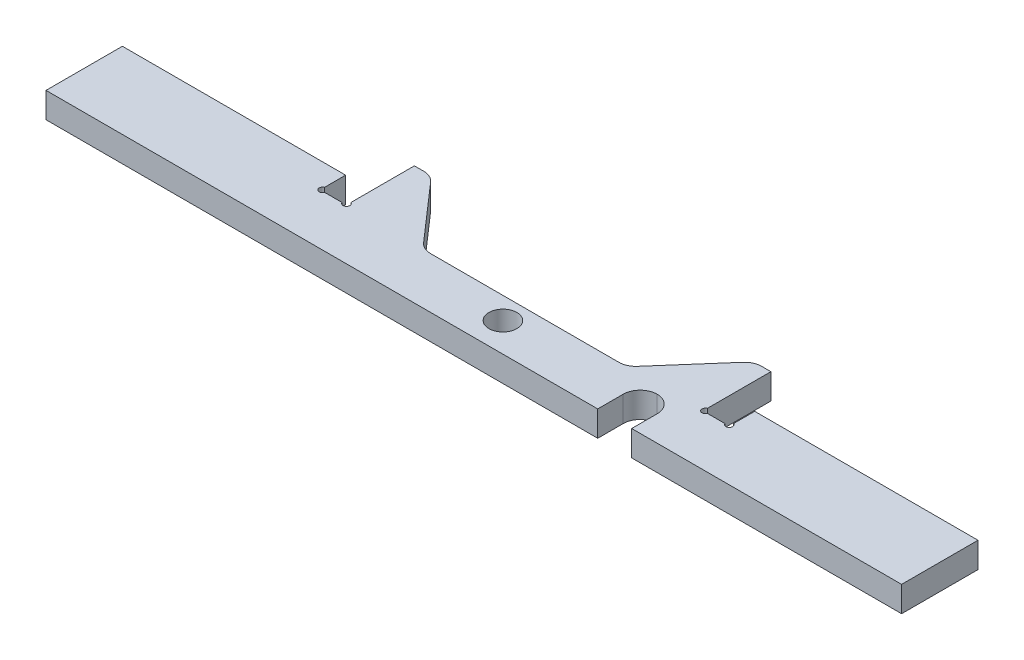
ISO-10303-21;
HEADER;
FILE_DESCRIPTION(('STEP AP214'),'2;1');
FILE_NAME('part.step','',(''),(''),'','','');
FILE_SCHEMA(('AUTOMOTIVE_DESIGN { 1 0 10303 214 1 1 1 1 }'));
ENDSEC;
DATA;
#1=APPLICATION_CONTEXT('core data for automotive mechanical design processes');
#2=APPLICATION_PROTOCOL_DEFINITION('international standard','automotive_design',2000,#1);
#3=PRODUCT_CONTEXT('',#1,'mechanical');
#4=PRODUCT('Part','Part','',(#3));
#5=PRODUCT_RELATED_PRODUCT_CATEGORY('part','',(#4));
#6=PRODUCT_DEFINITION_FORMATION('','',#4);
#7=PRODUCT_DEFINITION_CONTEXT('part definition',#1,'design');
#8=PRODUCT_DEFINITION('design','',#6,#7);
#9=PRODUCT_DEFINITION_SHAPE('','',#8);
#10=(LENGTH_UNIT() NAMED_UNIT(*) SI_UNIT(.MILLI.,.METRE.));
#11=(NAMED_UNIT(*) PLANE_ANGLE_UNIT() SI_UNIT($,.RADIAN.));
#12=(NAMED_UNIT(*) SI_UNIT($,.STERADIAN.) SOLID_ANGLE_UNIT());
#13=UNCERTAINTY_MEASURE_WITH_UNIT(LENGTH_MEASURE(1.E-05),#10,'distance_accuracy_value','');
#14=(GEOMETRIC_REPRESENTATION_CONTEXT(3) GLOBAL_UNCERTAINTY_ASSIGNED_CONTEXT((#13)) GLOBAL_UNIT_ASSIGNED_CONTEXT((#10,
#11,#12)) REPRESENTATION_CONTEXT('',''));
#15=CARTESIAN_POINT('',(0.,0.,0.));
#16=DIRECTION('',(0.,0.,1.));
#17=DIRECTION('',(1.,0.,0.));
#18=AXIS2_PLACEMENT_3D('',#15,#16,#17);
#19=CARTESIAN_POINT('',(-105.,15.,0.));
#20=DIRECTION('',(0.,0.,-1.));
#21=DIRECTION('',(-1.,0.,0.));
#22=AXIS2_PLACEMENT_3D('',#19,#20,#21);
#23=PLANE('',#22);
#24=DIRECTION('',(1.,0.,0.));
#25=VECTOR('',#24,1.);
#26=CARTESIAN_POINT('',(-105.,15.,0.));
#27=LINE('',#26,#25);
#28=CARTESIAN_POINT('',(93.,15.,0.));
#29=VERTEX_POINT('',#28);
#30=CARTESIAN_POINT('',(252.,15.,0.));
#31=VERTEX_POINT('',#30);
#32=EDGE_CURVE('E353',#29,#31,#27,.T.);
#33=ORIENTED_EDGE('',*,*,#32,.F.);
#34=DIRECTION('',(0.,1.,0.));
#35=VECTOR('',#34,1.);
#36=CARTESIAN_POINT('',(93.,0.,0.));
#37=LINE('',#36,#35);
#38=CARTESIAN_POINT('',(93.,0.,0.));
#39=VERTEX_POINT('',#38);
#40=EDGE_CURVE('E294',#39,#29,#37,.T.);
#41=ORIENTED_EDGE('',*,*,#40,.F.);
#42=DIRECTION('',(1.,0.,0.));
#43=VECTOR('',#42,1.);
#44=CARTESIAN_POINT('',(-105.,0.,0.));
#45=LINE('',#44,#43);
#46=CARTESIAN_POINT('',(252.,0.,0.));
#47=VERTEX_POINT('',#46);
#48=EDGE_CURVE('E385',#39,#47,#45,.T.);
#49=ORIENTED_EDGE('',*,*,#48,.T.);
#50=DIRECTION('',(0.,1.,0.));
#51=VECTOR('',#50,1.);
#52=CARTESIAN_POINT('',(252.,-153.733535703827,0.));
#53=LINE('',#52,#51);
#54=EDGE_CURVE('E305',#47,#31,#53,.T.);
#55=ORIENTED_EDGE('',*,*,#54,.T.);
#56=EDGE_LOOP('',(#33,#41,#49,#55));
#57=FACE_BOUND('',#56,.T.);
#58=ADVANCED_FACE('F45',(#57),#23,.F.);
#59=CARTESIAN_POINT('',(105.,15.,0.));
#60=DIRECTION('',(-1.,0.,0.));
#61=DIRECTION('',(0.,0.,1.));
#62=AXIS2_PLACEMENT_3D('',#59,#60,#61);
#63=PLANE('',#62);
#64=DIRECTION('',(0.,0.,-1.));
#65=VECTOR('',#64,1.);
#66=CARTESIAN_POINT('',(105.,15.,0.));
#67=LINE('',#66,#65);
#68=CARTESIAN_POINT('',(105.,15.,-32.5779354745735));
#69=VERTEX_POINT('',#68);
#70=CARTESIAN_POINT('',(105.,15.,-70.));
#71=VERTEX_POINT('',#70);
#72=EDGE_CURVE('E359',#69,#71,#67,.T.);
#73=ORIENTED_EDGE('',*,*,#72,.F.);
#74=DIRECTION('',(0.,1.,0.));
#75=VECTOR('',#74,1.);
#76=CARTESIAN_POINT('',(105.,0.,-32.5779354745735));
#77=LINE('',#76,#75);
#78=CARTESIAN_POINT('',(105.,0.,-32.5779354745735));
#79=VERTEX_POINT('',#78);
#80=EDGE_CURVE('E492',#69,#79,#77,.F.);
#81=ORIENTED_EDGE('',*,*,#80,.T.);
#82=DIRECTION('',(0.,0.,-1.));
#83=VECTOR('',#82,1.);
#84=CARTESIAN_POINT('',(105.,0.,0.));
#85=LINE('',#84,#83);
#86=CARTESIAN_POINT('',(105.,0.,-70.));
#87=VERTEX_POINT('',#86);
#88=EDGE_CURVE('E390',#79,#87,#85,.T.);
#89=ORIENTED_EDGE('',*,*,#88,.T.);
#90=DIRECTION('',(0.,-1.,0.));
#91=VECTOR('',#90,1.);
#92=CARTESIAN_POINT('',(105.,15.,-70.));
#93=LINE('',#92,#91);
#94=EDGE_CURVE('E414',#71,#87,#93,.T.);
#95=ORIENTED_EDGE('',*,*,#94,.F.);
#96=EDGE_LOOP('',(#73,#81,#89,#95));
#97=FACE_BOUND('',#96,.T.);
#98=ADVANCED_FACE('F620',(#97),#63,.F.);
#99=CARTESIAN_POINT('',(0.,15.,0.));
#100=DIRECTION('',(0.,-1.,0.));
#101=DIRECTION('',(0.,0.,-1.));
#102=AXIS2_PLACEMENT_3D('',#99,#100,#101);
#103=PLANE('',#102);
#104=DIRECTION('',(1.,0.,0.));
#105=VECTOR('',#104,1.);
#106=CARTESIAN_POINT('',(-120.5,15.,-30.));
#107=LINE('',#106,#105);
#108=CARTESIAN_POINT('',(-117.922064525426,15.,-30.));
#109=VERTEX_POINT('',#108);
#110=CARTESIAN_POINT('',(-107.577935474573,15.,-30.));
#111=VERTEX_POINT('',#110);
#112=EDGE_CURVE('E256',#109,#111,#107,.T.);
#113=ORIENTED_EDGE('',*,*,#112,.F.);
#114=CARTESIAN_POINT('',(-119.792893218813,15.,-30.7071067811865));
#115=DIRECTION('',(0.,1.,0.));
#116=DIRECTION('',(0.,0.,1.));
#117=AXIS2_PLACEMENT_3D('',#114,#115,#116);
#118=CIRCLE('',#117,2.);
#119=CARTESIAN_POINT('',(-120.5,15.,-32.5779354745735));
#120=VERTEX_POINT('',#119);
#121=EDGE_CURVE('E260',#120,#109,#118,.T.);
#122=ORIENTED_EDGE('',*,*,#121,.F.);
#123=DIRECTION('',(0.,0.,1.));
#124=VECTOR('',#123,1.);
#125=CARTESIAN_POINT('',(-120.5,15.,-45.));
#126=LINE('',#125,#124);
#127=CARTESIAN_POINT('',(-120.5,15.,-45.));
#128=VERTEX_POINT('',#127);
#129=EDGE_CURVE('E266',#128,#120,#126,.T.);
#130=ORIENTED_EDGE('',*,*,#129,.F.);
#131=DIRECTION('',(1.,0.,0.));
#132=VECTOR('',#131,1.);
#133=CARTESIAN_POINT('',(-252.,15.,-45.));
#134=LINE('',#133,#132);
#135=CARTESIAN_POINT('',(-252.,15.,-45.));
#136=VERTEX_POINT('',#135);
#137=EDGE_CURVE('E298',#136,#128,#134,.T.);
#138=ORIENTED_EDGE('',*,*,#137,.F.);
#139=DIRECTION('',(0.,0.,-1.));
#140=VECTOR('',#139,1.);
#141=CARTESIAN_POINT('',(-252.,15.,0.));
#142=LINE('',#141,#140);
#143=CARTESIAN_POINT('',(-252.,15.,0.));
#144=VERTEX_POINT('',#143);
#145=EDGE_CURVE('E293',#144,#136,#142,.T.);
#146=ORIENTED_EDGE('',*,*,#145,.F.);
#147=CARTESIAN_POINT('',(73.,15.,0.));
#148=VERTEX_POINT('',#147);
#149=EDGE_CURVE('E355',#144,#148,#27,.T.);
#150=ORIENTED_EDGE('',*,*,#149,.T.);
#151=DIRECTION('',(0.,0.,1.));
#152=VECTOR('',#151,1.);
#153=CARTESIAN_POINT('',(73.,15.,0.));
#154=LINE('',#153,#152);
#155=CARTESIAN_POINT('',(73.,15.,-15.));
#156=VERTEX_POINT('',#155);
#157=EDGE_CURVE('E543',#156,#148,#154,.T.);
#158=ORIENTED_EDGE('',*,*,#157,.F.);
#159=CARTESIAN_POINT('',(83.,15.,-15.));
#160=DIRECTION('',(0.,-1.,0.));
#161=DIRECTION('',(0.,0.,-1.));
#162=AXIS2_PLACEMENT_3D('',#159,#160,#161);
#163=CIRCLE('',#162,10.);
#164=CARTESIAN_POINT('',(83.,15.,-25.));
#165=VERTEX_POINT('',#164);
#166=EDGE_CURVE('E477',#156,#165,#163,.T.);
#167=ORIENTED_EDGE('',*,*,#166,.T.);
#168=CARTESIAN_POINT('',(83.,15.,-15.));
#169=DIRECTION('',(0.,-1.,0.));
#170=DIRECTION('',(0.,0.,-1.));
#171=AXIS2_PLACEMENT_3D('',#168,#169,#170);
#172=CIRCLE('',#171,10.);
#173=CARTESIAN_POINT('',(93.,15.,-15.));
#174=VERTEX_POINT('',#173);
#175=EDGE_CURVE('E483',#165,#174,#172,.T.);
#176=ORIENTED_EDGE('',*,*,#175,.T.);
#177=DIRECTION('',(0.,0.,-1.));
#178=VECTOR('',#177,1.);
#179=CARTESIAN_POINT('',(93.,15.,0.));
#180=LINE('',#179,#178);
#181=EDGE_CURVE('E491',#29,#174,#180,.T.);
#182=ORIENTED_EDGE('',*,*,#181,.F.);
#183=ORIENTED_EDGE('',*,*,#32,.T.);
#184=DIRECTION('',(0.,0.,-1.));
#185=VECTOR('',#184,1.);
#186=CARTESIAN_POINT('',(252.,15.,0.));
#187=LINE('',#186,#185);
#188=CARTESIAN_POINT('',(252.,15.,-45.));
#189=VERTEX_POINT('',#188);
#190=EDGE_CURVE('E281',#31,#189,#187,.T.);
#191=ORIENTED_EDGE('',*,*,#190,.T.);
#192=DIRECTION('',(-1.,0.,0.));
#193=VECTOR('',#192,1.);
#194=CARTESIAN_POINT('',(252.,15.,-45.));
#195=LINE('',#194,#193);
#196=CARTESIAN_POINT('',(120.5,15.,-45.));
#197=VERTEX_POINT('',#196);
#198=EDGE_CURVE('E310',#189,#197,#195,.T.);
#199=ORIENTED_EDGE('',*,*,#198,.T.);
#200=DIRECTION('',(0.,0.,1.));
#201=VECTOR('',#200,1.);
#202=CARTESIAN_POINT('',(120.5,15.,-45.));
#203=LINE('',#202,#201);
#204=CARTESIAN_POINT('',(120.5,15.,-32.5779354745735));
#205=VERTEX_POINT('',#204);
#206=EDGE_CURVE('E306',#197,#205,#203,.T.);
#207=ORIENTED_EDGE('',*,*,#206,.T.);
#208=CARTESIAN_POINT('',(119.792893218813,15.,-30.7071067811865));
#209=DIRECTION('',(0.,1.,0.));
#210=DIRECTION('',(0.,0.,-1.));
#211=AXIS2_PLACEMENT_3D('',#208,#209,#210);
#212=CIRCLE('',#211,2.);
#213=CARTESIAN_POINT('',(117.922064525426,15.,-30.));
#214=VERTEX_POINT('',#213);
#215=EDGE_CURVE('E498',#214,#205,#212,.T.);
#216=ORIENTED_EDGE('',*,*,#215,.F.);
#217=DIRECTION('',(-1.,0.,0.));
#218=VECTOR('',#217,1.);
#219=CARTESIAN_POINT('',(120.5,15.,-30.));
#220=LINE('',#219,#218);
#221=CARTESIAN_POINT('',(107.577935474573,15.,-30.));
#222=VERTEX_POINT('',#221);
#223=EDGE_CURVE('E301',#214,#222,#220,.T.);
#224=ORIENTED_EDGE('',*,*,#223,.T.);
#225=CARTESIAN_POINT('',(105.707106781187,15.,-30.7071067811865));
#226=DIRECTION('',(0.,1.,0.));
#227=DIRECTION('',(0.,0.,1.));
#228=AXIS2_PLACEMENT_3D('',#225,#226,#227);
#229=CIRCLE('',#228,2.);
#230=EDGE_CURVE('E60',#69,#222,#229,.T.);
#231=ORIENTED_EDGE('',*,*,#230,.F.);
#232=ORIENTED_EDGE('',*,*,#72,.T.);
#233=DIRECTION('',(-1.,0.,0.));
#234=VECTOR('',#233,1.);
#235=CARTESIAN_POINT('',(105.,15.,-70.));
#236=LINE('',#235,#234);
#237=CARTESIAN_POINT('',(99.5376822659183,15.,-70.));
#238=VERTEX_POINT('',#237);
#239=EDGE_CURVE('E362',#71,#238,#236,.T.);
#240=ORIENTED_EDGE('',*,*,#239,.T.);
#241=CARTESIAN_POINT('',(99.5376822659183,15.,-60.));
#242=DIRECTION('',(0.,-1.,0.));
#243=DIRECTION('',(0.,0.,-1.));
#244=AXIS2_PLACEMENT_3D('',#241,#242,#243);
#245=CIRCLE('',#244,10.);
#246=CARTESIAN_POINT('',(92.0119153188495,15.,-66.5850460786852));
#247=VERTEX_POINT('',#246);
#248=EDGE_CURVE('E449',#238,#247,#245,.F.);
#249=ORIENTED_EDGE('',*,*,#248,.T.);
#250=DIRECTION('',(-0.658504607868518,0.,0.752576694706878));
#251=VECTOR('',#250,1.);
#252=CARTESIAN_POINT('',(60.,15.,-30.));
#253=LINE('',#252,#251);
#254=CARTESIAN_POINT('',(62.9880846811505,15.,-33.4149539213148));
#255=VERTEX_POINT('',#254);
#256=EDGE_CURVE('E366',#247,#255,#253,.T.);
#257=ORIENTED_EDGE('',*,*,#256,.T.);
#258=CARTESIAN_POINT('',(55.4623177340817,15.,-40.));
#259=DIRECTION('',(0.,-1.,0.));
#260=DIRECTION('',(0.,0.,-1.));
#261=AXIS2_PLACEMENT_3D('',#258,#259,#260);
#262=CIRCLE('',#261,10.);
#263=CARTESIAN_POINT('',(55.4623177340817,15.,-30.));
#264=VERTEX_POINT('',#263);
#265=EDGE_CURVE('E467',#255,#264,#262,.T.);
#266=ORIENTED_EDGE('',*,*,#265,.T.);
#267=DIRECTION('',(-1.,0.,0.));
#268=VECTOR('',#267,1.);
#269=CARTESIAN_POINT('',(60.,15.,-30.));
#270=LINE('',#269,#268);
#271=CARTESIAN_POINT('',(-55.4623177340817,15.,-30.));
#272=VERTEX_POINT('',#271);
#273=EDGE_CURVE('E370',#264,#272,#270,.T.);
#274=ORIENTED_EDGE('',*,*,#273,.T.);
#275=CARTESIAN_POINT('',(-55.4623177340817,15.,-40.));
#276=DIRECTION('',(0.,-1.,0.));
#277=DIRECTION('',(0.,0.,-1.));
#278=AXIS2_PLACEMENT_3D('',#275,#276,#277);
#279=CIRCLE('',#278,10.);
#280=CARTESIAN_POINT('',(-62.9880846811505,15.,-33.4149539213148));
#281=VERTEX_POINT('',#280);
#282=EDGE_CURVE('E461',#272,#281,#279,.T.);
#283=ORIENTED_EDGE('',*,*,#282,.T.);
#284=DIRECTION('',(-0.658504607868518,0.,-0.752576694706878));
#285=VECTOR('',#284,1.);
#286=CARTESIAN_POINT('',(-60.,15.,-30.));
#287=LINE('',#286,#285);
#288=CARTESIAN_POINT('',(-92.0119153188495,15.,-66.5850460786852));
#289=VERTEX_POINT('',#288);
#290=EDGE_CURVE('E374',#281,#289,#287,.T.);
#291=ORIENTED_EDGE('',*,*,#290,.T.);
#292=CARTESIAN_POINT('',(-99.5376822659183,15.,-60.));
#293=DIRECTION('',(0.,-1.,0.));
#294=DIRECTION('',(0.,0.,-1.));
#295=AXIS2_PLACEMENT_3D('',#292,#293,#294);
#296=CIRCLE('',#295,10.);
#297=CARTESIAN_POINT('',(-99.5376822659183,15.,-70.));
#298=VERTEX_POINT('',#297);
#299=EDGE_CURVE('E452',#289,#298,#296,.F.);
#300=ORIENTED_EDGE('',*,*,#299,.T.);
#301=DIRECTION('',(-1.,0.,0.));
#302=VECTOR('',#301,1.);
#303=CARTESIAN_POINT('',(-105.,15.,-70.));
#304=LINE('',#303,#302);
#305=CARTESIAN_POINT('',(-105.,15.,-70.));
#306=VERTEX_POINT('',#305);
#307=EDGE_CURVE('E378',#298,#306,#304,.T.);
#308=ORIENTED_EDGE('',*,*,#307,.T.);
#309=DIRECTION('',(0.,0.,1.));
#310=VECTOR('',#309,1.);
#311=CARTESIAN_POINT('',(-105.,15.,0.));
#312=LINE('',#311,#310);
#313=CARTESIAN_POINT('',(-105.,15.,-32.5779354745735));
#314=VERTEX_POINT('',#313);
#315=EDGE_CURVE('E258',#306,#314,#312,.T.);
#316=ORIENTED_EDGE('',*,*,#315,.T.);
#317=CARTESIAN_POINT('',(-105.707106781187,15.,-30.7071067811865));
#318=DIRECTION('',(0.,1.,0.));
#319=DIRECTION('',(0.,0.,-1.));
#320=AXIS2_PLACEMENT_3D('',#317,#318,#319);
#321=CIRCLE('',#320,2.);
#322=EDGE_CURVE('E238',#111,#314,#321,.T.);
#323=ORIENTED_EDGE('',*,*,#322,.F.);
#324=EDGE_LOOP('',(#113,#122,#130,#138,#146,#150,#158,#167,#176,#182,#183,#191,#199,#207,#216,
#224,#231,#232,#240,#249,#257,#266,#274,#283,#291,#300,#308,#316,#323));
#325=FACE_BOUND('',#324,.T.);
#326=CARTESIAN_POINT('',(0.,15.,-17.15));
#327=DIRECTION('',(0.,1.,0.));
#328=DIRECTION('',(0.,0.,1.));
#329=AXIS2_PLACEMENT_3D('',#326,#327,#328);
#330=CIRCLE('',#329,8.25);
#331=CARTESIAN_POINT('',(0.,15.,-8.9));
#332=VERTEX_POINT('',#331);
#333=EDGE_CURVE('E343',#332,#332,#330,.T.);
#334=ORIENTED_EDGE('',*,*,#333,.F.);
#335=EDGE_LOOP('',(#334));
#336=FACE_BOUND('',#335,.T.);
#337=ADVANCED_FACE('F253',(#325,#336),#103,.F.);
#338=CARTESIAN_POINT('',(0.,0.,0.));
#339=DIRECTION('',(0.,-1.,0.));
#340=DIRECTION('',(0.,0.,-1.));
#341=AXIS2_PLACEMENT_3D('',#338,#339,#340);
#342=PLANE('',#341);
#343=CARTESIAN_POINT('',(-119.792893218813,0.,-30.7071067811865));
#344=DIRECTION('',(0.,1.,0.));
#345=DIRECTION('',(0.,0.,1.));
#346=AXIS2_PLACEMENT_3D('',#343,#344,#345);
#347=CIRCLE('',#346,2.);
#348=CARTESIAN_POINT('',(-120.5,0.,-32.5779354745735));
#349=VERTEX_POINT('',#348);
#350=CARTESIAN_POINT('',(-117.922064525426,0.,-30.));
#351=VERTEX_POINT('',#350);
#352=EDGE_CURVE('E529',#349,#351,#347,.T.);
#353=ORIENTED_EDGE('',*,*,#352,.T.);
#354=DIRECTION('',(1.,0.,0.));
#355=VECTOR('',#354,1.);
#356=CARTESIAN_POINT('',(-120.5,0.,-30.));
#357=LINE('',#356,#355);
#358=CARTESIAN_POINT('',(-107.577935474573,0.,-30.));
#359=VERTEX_POINT('',#358);
#360=EDGE_CURVE('E265',#351,#359,#357,.T.);
#361=ORIENTED_EDGE('',*,*,#360,.T.);
#362=CARTESIAN_POINT('',(-105.707106781187,0.,-30.7071067811865));
#363=DIRECTION('',(0.,1.,0.));
#364=DIRECTION('',(0.,0.,-1.));
#365=AXIS2_PLACEMENT_3D('',#362,#363,#364);
#366=CIRCLE('',#365,2.);
#367=CARTESIAN_POINT('',(-105.,0.,-32.5779354745735));
#368=VERTEX_POINT('',#367);
#369=EDGE_CURVE('E241',#359,#368,#366,.T.);
#370=ORIENTED_EDGE('',*,*,#369,.T.);
#371=DIRECTION('',(0.,0.,1.));
#372=VECTOR('',#371,1.);
#373=CARTESIAN_POINT('',(-105.,0.,0.));
#374=LINE('',#373,#372);
#375=CARTESIAN_POINT('',(-105.,0.,-70.));
#376=VERTEX_POINT('',#375);
#377=EDGE_CURVE('E347',#376,#368,#374,.T.);
#378=ORIENTED_EDGE('',*,*,#377,.F.);
#379=DIRECTION('',(-1.,0.,0.));
#380=VECTOR('',#379,1.);
#381=CARTESIAN_POINT('',(-105.,0.,-70.));
#382=LINE('',#381,#380);
#383=CARTESIAN_POINT('',(-99.5376822659183,0.,-70.));
#384=VERTEX_POINT('',#383);
#385=EDGE_CURVE('E354',#384,#376,#382,.T.);
#386=ORIENTED_EDGE('',*,*,#385,.F.);
#387=CARTESIAN_POINT('',(-99.5376822659183,0.,-60.));
#388=DIRECTION('',(0.,-1.,0.));
#389=DIRECTION('',(0.,0.,-1.));
#390=AXIS2_PLACEMENT_3D('',#387,#388,#389);
#391=CIRCLE('',#390,10.);
#392=CARTESIAN_POINT('',(-92.0119153188495,0.,-66.5850460786852));
#393=VERTEX_POINT('',#392);
#394=EDGE_CURVE('E446',#384,#393,#391,.T.);
#395=ORIENTED_EDGE('',*,*,#394,.T.);
#396=DIRECTION('',(-0.658504607868518,0.,-0.752576694706878));
#397=VECTOR('',#396,1.);
#398=CARTESIAN_POINT('',(-60.,0.,-30.));
#399=LINE('',#398,#397);
#400=CARTESIAN_POINT('',(-62.9880846811505,0.,-33.4149539213148));
#401=VERTEX_POINT('',#400);
#402=EDGE_CURVE('E405',#401,#393,#399,.T.);
#403=ORIENTED_EDGE('',*,*,#402,.F.);
#404=CARTESIAN_POINT('',(-55.4623177340817,0.,-40.));
#405=DIRECTION('',(0.,-1.,0.));
#406=DIRECTION('',(0.,0.,-1.));
#407=AXIS2_PLACEMENT_3D('',#404,#405,#406);
#408=CIRCLE('',#407,10.);
#409=CARTESIAN_POINT('',(-55.4623177340817,0.,-30.));
#410=VERTEX_POINT('',#409);
#411=EDGE_CURVE('E458',#401,#410,#408,.F.);
#412=ORIENTED_EDGE('',*,*,#411,.T.);
#413=DIRECTION('',(-1.,0.,0.));
#414=VECTOR('',#413,1.);
#415=CARTESIAN_POINT('',(60.,0.,-30.));
#416=LINE('',#415,#414);
#417=CARTESIAN_POINT('',(55.4623177340817,0.,-30.));
#418=VERTEX_POINT('',#417);
#419=EDGE_CURVE('E401',#418,#410,#416,.T.);
#420=ORIENTED_EDGE('',*,*,#419,.F.);
#421=CARTESIAN_POINT('',(55.4623177340817,0.,-40.));
#422=DIRECTION('',(0.,-1.,0.));
#423=DIRECTION('',(0.,0.,-1.));
#424=AXIS2_PLACEMENT_3D('',#421,#422,#423);
#425=CIRCLE('',#424,10.);
#426=CARTESIAN_POINT('',(62.9880846811505,0.,-33.4149539213148));
#427=VERTEX_POINT('',#426);
#428=EDGE_CURVE('E464',#418,#427,#425,.F.);
#429=ORIENTED_EDGE('',*,*,#428,.T.);
#430=DIRECTION('',(-0.658504607868518,0.,0.752576694706878));
#431=VECTOR('',#430,1.);
#432=CARTESIAN_POINT('',(60.,0.,-30.));
#433=LINE('',#432,#431);
#434=CARTESIAN_POINT('',(92.0119153188495,0.,-66.5850460786852));
#435=VERTEX_POINT('',#434);
#436=EDGE_CURVE('E397',#435,#427,#433,.T.);
#437=ORIENTED_EDGE('',*,*,#436,.F.);
#438=CARTESIAN_POINT('',(99.5376822659183,0.,-60.));
#439=DIRECTION('',(0.,-1.,0.));
#440=DIRECTION('',(0.,0.,-1.));
#441=AXIS2_PLACEMENT_3D('',#438,#439,#440);
#442=CIRCLE('',#441,10.);
#443=CARTESIAN_POINT('',(99.5376822659183,0.,-70.));
#444=VERTEX_POINT('',#443);
#445=EDGE_CURVE('E443',#435,#444,#442,.T.);
#446=ORIENTED_EDGE('',*,*,#445,.T.);
#447=DIRECTION('',(-1.,0.,0.));
#448=VECTOR('',#447,1.);
#449=CARTESIAN_POINT('',(105.,0.,-70.));
#450=LINE('',#449,#448);
#451=EDGE_CURVE('E393',#87,#444,#450,.T.);
#452=ORIENTED_EDGE('',*,*,#451,.F.);
#453=ORIENTED_EDGE('',*,*,#88,.F.);
#454=CARTESIAN_POINT('',(105.707106781187,0.,-30.7071067811865));
#455=DIRECTION('',(0.,1.,0.));
#456=DIRECTION('',(0.,0.,1.));
#457=AXIS2_PLACEMENT_3D('',#454,#455,#456);
#458=CIRCLE('',#457,2.);
#459=CARTESIAN_POINT('',(107.577935474573,0.,-30.));
#460=VERTEX_POINT('',#459);
#461=EDGE_CURVE('E505',#79,#460,#458,.T.);
#462=ORIENTED_EDGE('',*,*,#461,.T.);
#463=DIRECTION('',(-1.,0.,0.));
#464=VECTOR('',#463,1.);
#465=CARTESIAN_POINT('',(120.5,0.,-30.));
#466=LINE('',#465,#464);
#467=CARTESIAN_POINT('',(117.922064525426,0.,-30.));
#468=VERTEX_POINT('',#467);
#469=EDGE_CURVE('E317',#468,#460,#466,.T.);
#470=ORIENTED_EDGE('',*,*,#469,.F.);
#471=CARTESIAN_POINT('',(119.792893218813,0.,-30.7071067811865));
#472=DIRECTION('',(0.,1.,0.));
#473=DIRECTION('',(0.,0.,-1.));
#474=AXIS2_PLACEMENT_3D('',#471,#472,#473);
#475=CIRCLE('',#474,2.);
#476=CARTESIAN_POINT('',(120.5,0.,-32.5779354745735));
#477=VERTEX_POINT('',#476);
#478=EDGE_CURVE('E68',#468,#477,#475,.T.);
#479=ORIENTED_EDGE('',*,*,#478,.T.);
#480=DIRECTION('',(0.,0.,1.));
#481=VECTOR('',#480,1.);
#482=CARTESIAN_POINT('',(120.5,0.,-45.));
#483=LINE('',#482,#481);
#484=CARTESIAN_POINT('',(120.5,0.,-45.));
#485=VERTEX_POINT('',#484);
#486=EDGE_CURVE('E322',#485,#477,#483,.T.);
#487=ORIENTED_EDGE('',*,*,#486,.F.);
#488=DIRECTION('',(-1.,0.,0.));
#489=VECTOR('',#488,1.);
#490=CARTESIAN_POINT('',(252.,0.,-45.));
#491=LINE('',#490,#489);
#492=CARTESIAN_POINT('',(252.,0.,-45.));
#493=VERTEX_POINT('',#492);
#494=EDGE_CURVE('E327',#493,#485,#491,.T.);
#495=ORIENTED_EDGE('',*,*,#494,.F.);
#496=DIRECTION('',(0.,0.,-1.));
#497=VECTOR('',#496,1.);
#498=CARTESIAN_POINT('',(252.,0.,0.));
#499=LINE('',#498,#497);
#500=EDGE_CURVE('E332',#47,#493,#499,.T.);
#501=ORIENTED_EDGE('',*,*,#500,.F.);
#502=ORIENTED_EDGE('',*,*,#48,.F.);
#503=DIRECTION('',(0.,0.,-1.));
#504=VECTOR('',#503,1.);
#505=CARTESIAN_POINT('',(93.,0.,0.));
#506=LINE('',#505,#504);
#507=CARTESIAN_POINT('',(93.,0.,-15.));
#508=VERTEX_POINT('',#507);
#509=EDGE_CURVE('E538',#39,#508,#506,.T.);
#510=ORIENTED_EDGE('',*,*,#509,.T.);
#511=CARTESIAN_POINT('',(83.,0.,-15.));
#512=DIRECTION('',(0.,-1.,0.));
#513=DIRECTION('',(0.,0.,-1.));
#514=AXIS2_PLACEMENT_3D('',#511,#512,#513);
#515=CIRCLE('',#514,10.);
#516=CARTESIAN_POINT('',(83.,0.,-25.));
#517=VERTEX_POINT('',#516);
#518=EDGE_CURVE('E248',#508,#517,#515,.F.);
#519=ORIENTED_EDGE('',*,*,#518,.T.);
#520=CARTESIAN_POINT('',(83.,0.,-15.));
#521=DIRECTION('',(0.,-1.,0.));
#522=DIRECTION('',(0.,0.,-1.));
#523=AXIS2_PLACEMENT_3D('',#520,#521,#522);
#524=CIRCLE('',#523,10.);
#525=CARTESIAN_POINT('',(73.,0.,-15.));
#526=VERTEX_POINT('',#525);
#527=EDGE_CURVE('E480',#517,#526,#524,.F.);
#528=ORIENTED_EDGE('',*,*,#527,.T.);
#529=DIRECTION('',(0.,0.,1.));
#530=VECTOR('',#529,1.);
#531=CARTESIAN_POINT('',(73.,0.,0.));
#532=LINE('',#531,#530);
#533=CARTESIAN_POINT('',(73.,0.,0.));
#534=VERTEX_POINT('',#533);
#535=EDGE_CURVE('E542',#526,#534,#532,.T.);
#536=ORIENTED_EDGE('',*,*,#535,.T.);
#537=CARTESIAN_POINT('',(-252.,0.,0.));
#538=VERTEX_POINT('',#537);
#539=EDGE_CURVE('E386',#538,#534,#45,.T.);
#540=ORIENTED_EDGE('',*,*,#539,.F.);
#541=DIRECTION('',(0.,0.,-1.));
#542=VECTOR('',#541,1.);
#543=CARTESIAN_POINT('',(-252.,0.,0.));
#544=LINE('',#543,#542);
#545=CARTESIAN_POINT('',(-252.,0.,-45.));
#546=VERTEX_POINT('',#545);
#547=EDGE_CURVE('E270',#538,#546,#544,.T.);
#548=ORIENTED_EDGE('',*,*,#547,.T.);
#549=DIRECTION('',(1.,0.,0.));
#550=VECTOR('',#549,1.);
#551=CARTESIAN_POINT('',(-252.,0.,-45.));
#552=LINE('',#551,#550);
#553=CARTESIAN_POINT('',(-120.5,0.,-45.));
#554=VERTEX_POINT('',#553);
#555=EDGE_CURVE('E282',#546,#554,#552,.T.);
#556=ORIENTED_EDGE('',*,*,#555,.T.);
#557=DIRECTION('',(0.,0.,1.));
#558=VECTOR('',#557,1.);
#559=CARTESIAN_POINT('',(-120.5,0.,-45.));
#560=LINE('',#559,#558);
#561=EDGE_CURVE('E277',#554,#349,#560,.T.);
#562=ORIENTED_EDGE('',*,*,#561,.T.);
#563=EDGE_LOOP('',(#353,#361,#370,#378,#386,#395,#403,#412,#420,#429,#437,#446,#452,#453,#462,
#470,#479,#487,#495,#501,#502,#510,#519,#528,#536,#540,#548,#556,#562));
#564=FACE_BOUND('',#563,.T.);
#565=CARTESIAN_POINT('',(0.,0.,-17.15));
#566=DIRECTION('',(0.,1.,0.));
#567=DIRECTION('',(0.,0.,1.));
#568=AXIS2_PLACEMENT_3D('',#565,#566,#567);
#569=CIRCLE('',#568,8.25);
#570=CARTESIAN_POINT('',(0.,0.,-8.9));
#571=VERTEX_POINT('',#570);
#572=EDGE_CURVE('E321',#571,#571,#569,.T.);
#573=ORIENTED_EDGE('',*,*,#572,.T.);
#574=EDGE_LOOP('',(#573));
#575=FACE_BOUND('',#574,.T.);
#576=ADVANCED_FACE('F514',(#564,#575),#342,.T.);
#577=CARTESIAN_POINT('',(-105.,15.,0.));
#578=DIRECTION('',(1.,0.,0.));
#579=DIRECTION('',(0.,0.,-1.));
#580=AXIS2_PLACEMENT_3D('',#577,#578,#579);
#581=PLANE('',#580);
#582=ORIENTED_EDGE('',*,*,#377,.T.);
#583=DIRECTION('',(0.,1.,0.));
#584=VECTOR('',#583,1.);
#585=CARTESIAN_POINT('',(-105.,0.,-32.5779354745735));
#586=LINE('',#585,#584);
#587=EDGE_CURVE('E525',#368,#314,#586,.T.);
#588=ORIENTED_EDGE('',*,*,#587,.T.);
#589=ORIENTED_EDGE('',*,*,#315,.F.);
#590=DIRECTION('',(0.,-1.,0.));
#591=VECTOR('',#590,1.);
#592=CARTESIAN_POINT('',(-105.,15.,-70.));
#593=LINE('',#592,#591);
#594=EDGE_CURVE('E381',#306,#376,#593,.T.);
#595=ORIENTED_EDGE('',*,*,#594,.T.);
#596=EDGE_LOOP('',(#582,#588,#589,#595));
#597=FACE_BOUND('',#596,.T.);
#598=ADVANCED_FACE('F630',(#597),#581,.F.);
#599=ORIENTED_EDGE('',*,*,#539,.T.);
#600=DIRECTION('',(0.,1.,0.));
#601=VECTOR('',#600,1.);
#602=CARTESIAN_POINT('',(73.,0.,0.));
#603=LINE('',#602,#601);
#604=EDGE_CURVE('E546',#534,#148,#603,.T.);
#605=ORIENTED_EDGE('',*,*,#604,.T.);
#606=ORIENTED_EDGE('',*,*,#149,.F.);
#607=DIRECTION('',(0.,1.,0.));
#608=VECTOR('',#607,1.);
#609=CARTESIAN_POINT('',(-252.,-153.733535703827,0.));
#610=LINE('',#609,#608);
#611=EDGE_CURVE('E289',#538,#144,#610,.T.);
#612=ORIENTED_EDGE('',*,*,#611,.F.);
#613=EDGE_LOOP('',(#599,#605,#606,#612));
#614=FACE_BOUND('',#613,.T.);
#615=ADVANCED_FACE('F576',(#614),#23,.F.);
#616=CARTESIAN_POINT('',(105.,15.,-70.));
#617=DIRECTION('',(0.,0.,1.));
#618=DIRECTION('',(1.,0.,0.));
#619=AXIS2_PLACEMENT_3D('',#616,#617,#618);
#620=PLANE('',#619);
#621=ORIENTED_EDGE('',*,*,#451,.T.);
#622=DIRECTION('',(0.,-1.,0.));
#623=VECTOR('',#622,1.);
#624=CARTESIAN_POINT('',(99.5376822659183,15.,-70.));
#625=LINE('',#624,#623);
#626=EDGE_CURVE('E455',#444,#238,#625,.F.);
#627=ORIENTED_EDGE('',*,*,#626,.T.);
#628=ORIENTED_EDGE('',*,*,#239,.F.);
#629=ORIENTED_EDGE('',*,*,#94,.T.);
#630=EDGE_LOOP('',(#621,#627,#628,#629));
#631=FACE_BOUND('',#630,.T.);
#632=ADVANCED_FACE('F629',(#631),#620,.F.);
#633=CARTESIAN_POINT('',(60.,15.,-30.));
#634=DIRECTION('',(0.752576694706878,0.,0.658504607868518));
#635=DIRECTION('',(0.658504607868518,0.,-0.752576694706878));
#636=AXIS2_PLACEMENT_3D('',#633,#634,#635);
#637=PLANE('',#636);
#638=ORIENTED_EDGE('',*,*,#436,.T.);
#639=DIRECTION('',(0.,-1.,0.));
#640=VECTOR('',#639,1.);
#641=CARTESIAN_POINT('',(62.9880846811505,15.,-33.4149539213148));
#642=LINE('',#641,#640);
#643=EDGE_CURVE('E436',#427,#255,#642,.F.);
#644=ORIENTED_EDGE('',*,*,#643,.T.);
#645=ORIENTED_EDGE('',*,*,#256,.F.);
#646=DIRECTION('',(0.,-1.,0.));
#647=VECTOR('',#646,1.);
#648=CARTESIAN_POINT('',(92.0119153188495,15.,-66.5850460786852));
#649=LINE('',#648,#647);
#650=EDGE_CURVE('E432',#247,#435,#649,.T.);
#651=ORIENTED_EDGE('',*,*,#650,.T.);
#652=EDGE_LOOP('',(#638,#644,#645,#651));
#653=FACE_BOUND('',#652,.T.);
#654=ADVANCED_FACE('F635',(#653),#637,.F.);
#655=CARTESIAN_POINT('',(60.,15.,-30.));
#656=DIRECTION('',(0.,0.,1.));
#657=DIRECTION('',(1.,0.,0.));
#658=AXIS2_PLACEMENT_3D('',#655,#656,#657);
#659=PLANE('',#658);
#660=ORIENTED_EDGE('',*,*,#419,.T.);
#661=DIRECTION('',(0.,-1.,0.));
#662=VECTOR('',#661,1.);
#663=CARTESIAN_POINT('',(-55.4623177340817,15.,-30.));
#664=LINE('',#663,#662);
#665=EDGE_CURVE('E429',#410,#272,#664,.F.);
#666=ORIENTED_EDGE('',*,*,#665,.T.);
#667=ORIENTED_EDGE('',*,*,#273,.F.);
#668=DIRECTION('',(0.,-1.,0.));
#669=VECTOR('',#668,1.);
#670=CARTESIAN_POINT('',(55.4623177340817,0.,-30.));
#671=LINE('',#670,#669);
#672=EDGE_CURVE('E425',#264,#418,#671,.T.);
#673=ORIENTED_EDGE('',*,*,#672,.T.);
#674=EDGE_LOOP('',(#660,#666,#667,#673));
#675=FACE_BOUND('',#674,.T.);
#676=ADVANCED_FACE('F861',(#675),#659,.F.);
#677=CARTESIAN_POINT('',(-60.,15.,-30.));
#678=DIRECTION('',(-0.752576694706878,0.,0.658504607868518));
#679=DIRECTION('',(0.658504607868518,0.,0.752576694706878));
#680=AXIS2_PLACEMENT_3D('',#677,#678,#679);
#681=PLANE('',#680);
#682=ORIENTED_EDGE('',*,*,#290,.F.);
#683=DIRECTION('',(0.,-1.,0.));
#684=VECTOR('',#683,1.);
#685=CARTESIAN_POINT('',(-62.9880846811505,0.,-33.4149539213148));
#686=LINE('',#685,#684);
#687=EDGE_CURVE('E421',#281,#401,#686,.T.);
#688=ORIENTED_EDGE('',*,*,#687,.T.);
#689=ORIENTED_EDGE('',*,*,#402,.T.);
#690=DIRECTION('',(0.,-1.,0.));
#691=VECTOR('',#690,1.);
#692=CARTESIAN_POINT('',(-92.0119153188495,15.,-66.5850460786852));
#693=LINE('',#692,#691);
#694=EDGE_CURVE('E418',#393,#289,#693,.F.);
#695=ORIENTED_EDGE('',*,*,#694,.T.);
#696=EDGE_LOOP('',(#682,#688,#689,#695));
#697=FACE_BOUND('',#696,.T.);
#698=ADVANCED_FACE('F854',(#697),#681,.F.);
#699=CARTESIAN_POINT('',(-105.,15.,-70.));
#700=DIRECTION('',(0.,0.,1.));
#701=DIRECTION('',(1.,0.,0.));
#702=AXIS2_PLACEMENT_3D('',#699,#700,#701);
#703=PLANE('',#702);
#704=ORIENTED_EDGE('',*,*,#307,.F.);
#705=DIRECTION('',(0.,-1.,0.));
#706=VECTOR('',#705,1.);
#707=CARTESIAN_POINT('',(-99.5376822659183,15.,-70.));
#708=LINE('',#707,#706);
#709=EDGE_CURVE('E439',#298,#384,#708,.T.);
#710=ORIENTED_EDGE('',*,*,#709,.T.);
#711=ORIENTED_EDGE('',*,*,#385,.T.);
#712=ORIENTED_EDGE('',*,*,#594,.F.);
#713=EDGE_LOOP('',(#704,#710,#711,#712));
#714=FACE_BOUND('',#713,.T.);
#715=ADVANCED_FACE('F848',(#714),#703,.F.);
#716=CARTESIAN_POINT('',(0.,15.,-17.15));
#717=DIRECTION('',(0.,-1.,0.));
#718=DIRECTION('',(0.,0.,-1.));
#719=AXIS2_PLACEMENT_3D('',#716,#717,#718);
#720=CYLINDRICAL_SURFACE('',#719,8.25);
#721=ORIENTED_EDGE('',*,*,#333,.T.);
#722=EDGE_LOOP('',(#721));
#723=FACE_BOUND('',#722,.T.);
#724=ORIENTED_EDGE('',*,*,#572,.F.);
#725=EDGE_LOOP('',(#724));
#726=FACE_BOUND('',#725,.T.);
#727=ADVANCED_FACE('F648',(#723,#726),#720,.F.);
#728=CARTESIAN_POINT('',(-55.4623177340817,15.,-40.));
#729=DIRECTION('',(0.,1.,0.));
#730=DIRECTION('',(0.,0.,1.));
#731=AXIS2_PLACEMENT_3D('',#728,#729,#730);
#732=CYLINDRICAL_SURFACE('',#731,10.);
#733=ORIENTED_EDGE('',*,*,#282,.F.);
#734=ORIENTED_EDGE('',*,*,#665,.F.);
#735=ORIENTED_EDGE('',*,*,#411,.F.);
#736=ORIENTED_EDGE('',*,*,#687,.F.);
#737=EDGE_LOOP('',(#733,#734,#735,#736));
#738=FACE_BOUND('',#737,.T.);
#739=ADVANCED_FACE('F644',(#738),#732,.F.);
#740=CARTESIAN_POINT('',(55.4623177340817,15.,-40.));
#741=DIRECTION('',(0.,1.,0.));
#742=DIRECTION('',(0.,0.,1.));
#743=AXIS2_PLACEMENT_3D('',#740,#741,#742);
#744=CYLINDRICAL_SURFACE('',#743,10.);
#745=ORIENTED_EDGE('',*,*,#265,.F.);
#746=ORIENTED_EDGE('',*,*,#643,.F.);
#747=ORIENTED_EDGE('',*,*,#428,.F.);
#748=ORIENTED_EDGE('',*,*,#672,.F.);
#749=EDGE_LOOP('',(#745,#746,#747,#748));
#750=FACE_BOUND('',#749,.T.);
#751=ADVANCED_FACE('F647',(#750),#744,.F.);
#752=CARTESIAN_POINT('',(-99.5376822659183,15.,-60.));
#753=DIRECTION('',(0.,-1.,0.));
#754=DIRECTION('',(0.,0.,-1.));
#755=AXIS2_PLACEMENT_3D('',#752,#753,#754);
#756=CYLINDRICAL_SURFACE('',#755,10.);
#757=ORIENTED_EDGE('',*,*,#299,.F.);
#758=ORIENTED_EDGE('',*,*,#694,.F.);
#759=ORIENTED_EDGE('',*,*,#394,.F.);
#760=ORIENTED_EDGE('',*,*,#709,.F.);
#761=EDGE_LOOP('',(#757,#758,#759,#760));
#762=FACE_BOUND('',#761,.T.);
#763=ADVANCED_FACE('F652',(#762),#756,.T.);
#764=CARTESIAN_POINT('',(99.5376822659183,15.,-60.));
#765=DIRECTION('',(0.,-1.,0.));
#766=DIRECTION('',(0.,0.,-1.));
#767=AXIS2_PLACEMENT_3D('',#764,#765,#766);
#768=CYLINDRICAL_SURFACE('',#767,10.);
#769=ORIENTED_EDGE('',*,*,#248,.F.);
#770=ORIENTED_EDGE('',*,*,#626,.F.);
#771=ORIENTED_EDGE('',*,*,#445,.F.);
#772=ORIENTED_EDGE('',*,*,#650,.F.);
#773=EDGE_LOOP('',(#769,#770,#771,#772));
#774=FACE_BOUND('',#773,.T.);
#775=ADVANCED_FACE('F656',(#774),#768,.T.);
#776=CARTESIAN_POINT('',(252.,-153.733535703827,0.));
#777=DIRECTION('',(1.,0.,0.));
#778=DIRECTION('',(0.,0.,-1.));
#779=AXIS2_PLACEMENT_3D('',#776,#777,#778);
#780=PLANE('',#779);
#781=ORIENTED_EDGE('',*,*,#54,.F.);
#782=ORIENTED_EDGE('',*,*,#500,.T.);
#783=DIRECTION('',(0.,1.,0.));
#784=VECTOR('',#783,1.);
#785=CARTESIAN_POINT('',(252.,-153.733535703827,-45.));
#786=LINE('',#785,#784);
#787=EDGE_CURVE('E331',#493,#189,#786,.T.);
#788=ORIENTED_EDGE('',*,*,#787,.T.);
#789=ORIENTED_EDGE('',*,*,#190,.F.);
#790=EDGE_LOOP('',(#781,#782,#788,#789));
#791=FACE_BOUND('',#790,.T.);
#792=ADVANCED_FACE('F603',(#791),#780,.T.);
#793=CARTESIAN_POINT('',(252.,-153.733535703827,-45.));
#794=DIRECTION('',(0.,0.,-1.));
#795=DIRECTION('',(-1.,0.,0.));
#796=AXIS2_PLACEMENT_3D('',#793,#794,#795);
#797=PLANE('',#796);
#798=ORIENTED_EDGE('',*,*,#787,.F.);
#799=ORIENTED_EDGE('',*,*,#494,.T.);
#800=DIRECTION('',(0.,1.,0.));
#801=VECTOR('',#800,1.);
#802=CARTESIAN_POINT('',(120.5,-153.733535703827,-45.));
#803=LINE('',#802,#801);
#804=EDGE_CURVE('E326',#485,#197,#803,.T.);
#805=ORIENTED_EDGE('',*,*,#804,.T.);
#806=ORIENTED_EDGE('',*,*,#198,.F.);
#807=EDGE_LOOP('',(#798,#799,#805,#806));
#808=FACE_BOUND('',#807,.T.);
#809=ADVANCED_FACE('F607',(#808),#797,.T.);
#810=CARTESIAN_POINT('',(120.5,-153.733535703827,-45.));
#811=DIRECTION('',(-1.,0.,0.));
#812=DIRECTION('',(0.,0.,1.));
#813=AXIS2_PLACEMENT_3D('',#810,#811,#812);
#814=PLANE('',#813);
#815=DIRECTION('',(0.,1.,0.));
#816=VECTOR('',#815,1.);
#817=CARTESIAN_POINT('',(120.5,0.,-32.5779354745735));
#818=LINE('',#817,#816);
#819=EDGE_CURVE('E533',#205,#477,#818,.F.);
#820=ORIENTED_EDGE('',*,*,#819,.F.);
#821=ORIENTED_EDGE('',*,*,#206,.F.);
#822=ORIENTED_EDGE('',*,*,#804,.F.);
#823=ORIENTED_EDGE('',*,*,#486,.T.);
#824=EDGE_LOOP('',(#820,#821,#822,#823));
#825=FACE_BOUND('',#824,.T.);
#826=ADVANCED_FACE('F610',(#825),#814,.T.);
#827=CARTESIAN_POINT('',(120.5,-153.733535703827,-30.));
#828=DIRECTION('',(0.,0.,-1.));
#829=DIRECTION('',(-1.,0.,0.));
#830=AXIS2_PLACEMENT_3D('',#827,#828,#829);
#831=PLANE('',#830);
#832=DIRECTION('',(0.,1.,0.));
#833=VECTOR('',#832,1.);
#834=CARTESIAN_POINT('',(107.577935474573,0.,-30.));
#835=LINE('',#834,#833);
#836=EDGE_CURVE('E11',#222,#460,#835,.F.);
#837=ORIENTED_EDGE('',*,*,#836,.F.);
#838=ORIENTED_EDGE('',*,*,#223,.F.);
#839=DIRECTION('',(0.,1.,0.));
#840=VECTOR('',#839,1.);
#841=CARTESIAN_POINT('',(117.922064525426,0.,-30.));
#842=LINE('',#841,#840);
#843=EDGE_CURVE('E54',#468,#214,#842,.T.);
#844=ORIENTED_EDGE('',*,*,#843,.F.);
#845=ORIENTED_EDGE('',*,*,#469,.T.);
#846=EDGE_LOOP('',(#837,#838,#844,#845));
#847=FACE_BOUND('',#846,.T.);
#848=ADVANCED_FACE('F507',(#847),#831,.T.);
#849=CARTESIAN_POINT('',(-252.,-153.733535703827,0.));
#850=DIRECTION('',(1.,0.,0.));
#851=DIRECTION('',(0.,0.,-1.));
#852=AXIS2_PLACEMENT_3D('',#849,#850,#851);
#853=PLANE('',#852);
#854=ORIENTED_EDGE('',*,*,#547,.F.);
#855=ORIENTED_EDGE('',*,*,#611,.T.);
#856=ORIENTED_EDGE('',*,*,#145,.T.);
#857=DIRECTION('',(0.,1.,0.));
#858=VECTOR('',#857,1.);
#859=CARTESIAN_POINT('',(-252.,-153.733535703827,-45.));
#860=LINE('',#859,#858);
#861=EDGE_CURVE('E295',#546,#136,#860,.T.);
#862=ORIENTED_EDGE('',*,*,#861,.F.);
#863=EDGE_LOOP('',(#854,#855,#856,#862));
#864=FACE_BOUND('',#863,.T.);
#865=ADVANCED_FACE('F572',(#864),#853,.F.);
#866=CARTESIAN_POINT('',(-252.,-153.733535703827,-45.));
#867=DIRECTION('',(0.,0.,1.));
#868=DIRECTION('',(1.,0.,0.));
#869=AXIS2_PLACEMENT_3D('',#866,#867,#868);
#870=PLANE('',#869);
#871=ORIENTED_EDGE('',*,*,#555,.F.);
#872=ORIENTED_EDGE('',*,*,#861,.T.);
#873=ORIENTED_EDGE('',*,*,#137,.T.);
#874=DIRECTION('',(0.,1.,0.));
#875=VECTOR('',#874,1.);
#876=CARTESIAN_POINT('',(-120.5,-153.733535703827,-45.));
#877=LINE('',#876,#875);
#878=EDGE_CURVE('E273',#554,#128,#877,.T.);
#879=ORIENTED_EDGE('',*,*,#878,.F.);
#880=EDGE_LOOP('',(#871,#872,#873,#879));
#881=FACE_BOUND('',#880,.T.);
#882=ADVANCED_FACE('F565',(#881),#870,.F.);
#883=CARTESIAN_POINT('',(-120.5,-153.733535703827,-45.));
#884=DIRECTION('',(-1.,0.,0.));
#885=DIRECTION('',(0.,0.,1.));
#886=AXIS2_PLACEMENT_3D('',#883,#884,#885);
#887=PLANE('',#886);
#888=ORIENTED_EDGE('',*,*,#129,.T.);
#889=DIRECTION('',(0.,1.,0.));
#890=VECTOR('',#889,1.);
#891=CARTESIAN_POINT('',(-120.5,0.,-32.5779354745735));
#892=LINE('',#891,#890);
#893=EDGE_CURVE('E528',#120,#349,#892,.F.);
#894=ORIENTED_EDGE('',*,*,#893,.T.);
#895=ORIENTED_EDGE('',*,*,#561,.F.);
#896=ORIENTED_EDGE('',*,*,#878,.T.);
#897=EDGE_LOOP('',(#888,#894,#895,#896));
#898=FACE_BOUND('',#897,.T.);
#899=ADVANCED_FACE('F569',(#898),#887,.F.);
#900=CARTESIAN_POINT('',(-120.5,-153.733535703827,-30.));
#901=DIRECTION('',(0.,0.,1.));
#902=DIRECTION('',(1.,0.,0.));
#903=AXIS2_PLACEMENT_3D('',#900,#901,#902);
#904=PLANE('',#903);
#905=ORIENTED_EDGE('',*,*,#360,.F.);
#906=DIRECTION('',(0.,1.,0.));
#907=VECTOR('',#906,1.);
#908=CARTESIAN_POINT('',(-117.922064525426,0.,-30.));
#909=LINE('',#908,#907);
#910=EDGE_CURVE('E247',#351,#109,#909,.T.);
#911=ORIENTED_EDGE('',*,*,#910,.T.);
#912=ORIENTED_EDGE('',*,*,#112,.T.);
#913=DIRECTION('',(0.,1.,0.));
#914=VECTOR('',#913,1.);
#915=CARTESIAN_POINT('',(-107.577935474573,0.,-30.));
#916=LINE('',#915,#914);
#917=EDGE_CURVE('E235',#111,#359,#916,.F.);
#918=ORIENTED_EDGE('',*,*,#917,.T.);
#919=EDGE_LOOP('',(#905,#911,#912,#918));
#920=FACE_BOUND('',#919,.T.);
#921=ADVANCED_FACE('F263',(#920),#904,.F.);
#922=CARTESIAN_POINT('',(93.,0.,0.));
#923=DIRECTION('',(1.,0.,0.));
#924=DIRECTION('',(0.,0.,-1.));
#925=AXIS2_PLACEMENT_3D('',#922,#923,#924);
#926=PLANE('',#925);
#927=ORIENTED_EDGE('',*,*,#181,.T.);
#928=DIRECTION('',(0.,1.,0.));
#929=VECTOR('',#928,1.);
#930=CARTESIAN_POINT('',(93.,0.,-15.));
#931=LINE('',#930,#929);
#932=EDGE_CURVE('E474',#174,#508,#931,.F.);
#933=ORIENTED_EDGE('',*,*,#932,.T.);
#934=ORIENTED_EDGE('',*,*,#509,.F.);
#935=ORIENTED_EDGE('',*,*,#40,.T.);
#936=EDGE_LOOP('',(#927,#933,#934,#935));
#937=FACE_BOUND('',#936,.T.);
#938=ADVANCED_FACE('F592',(#937),#926,.F.);
#939=CARTESIAN_POINT('',(73.,0.,0.));
#940=DIRECTION('',(-1.,0.,0.));
#941=DIRECTION('',(0.,0.,1.));
#942=AXIS2_PLACEMENT_3D('',#939,#940,#941);
#943=PLANE('',#942);
#944=ORIENTED_EDGE('',*,*,#535,.F.);
#945=DIRECTION('',(0.,1.,0.));
#946=VECTOR('',#945,1.);
#947=CARTESIAN_POINT('',(73.,15.,-15.));
#948=LINE('',#947,#946);
#949=EDGE_CURVE('E470',#526,#156,#948,.T.);
#950=ORIENTED_EDGE('',*,*,#949,.T.);
#951=ORIENTED_EDGE('',*,*,#157,.T.);
#952=ORIENTED_EDGE('',*,*,#604,.F.);
#953=EDGE_LOOP('',(#944,#950,#951,#952));
#954=FACE_BOUND('',#953,.T.);
#955=ADVANCED_FACE('F580',(#954),#943,.F.);
#956=CARTESIAN_POINT('',(83.,0.,-15.));
#957=DIRECTION('',(0.,-1.,0.));
#958=DIRECTION('',(0.,0.,-1.));
#959=AXIS2_PLACEMENT_3D('',#956,#957,#958);
#960=CYLINDRICAL_SURFACE('',#959,10.);
#961=DIRECTION('',(0.,1.,0.));
#962=VECTOR('',#961,1.);
#963=CARTESIAN_POINT('',(83.,15.,-25.));
#964=LINE('',#963,#962);
#965=EDGE_CURVE('E488',#517,#165,#964,.T.);
#966=ORIENTED_EDGE('',*,*,#965,.F.);
#967=ORIENTED_EDGE('',*,*,#518,.F.);
#968=ORIENTED_EDGE('',*,*,#932,.F.);
#969=ORIENTED_EDGE('',*,*,#175,.F.);
#970=EDGE_LOOP('',(#966,#967,#968,#969));
#971=FACE_BOUND('',#970,.T.);
#972=ADVANCED_FACE('F47',(#971),#960,.F.);
#973=CARTESIAN_POINT('',(83.,0.,-15.));
#974=DIRECTION('',(0.,-1.,0.));
#975=DIRECTION('',(0.,0.,-1.));
#976=AXIS2_PLACEMENT_3D('',#973,#974,#975);
#977=CYLINDRICAL_SURFACE('',#976,10.);
#978=ORIENTED_EDGE('',*,*,#527,.F.);
#979=ORIENTED_EDGE('',*,*,#965,.T.);
#980=ORIENTED_EDGE('',*,*,#166,.F.);
#981=ORIENTED_EDGE('',*,*,#949,.F.);
#982=EDGE_LOOP('',(#978,#979,#980,#981));
#983=FACE_BOUND('',#982,.T.);
#984=ADVANCED_FACE('F584',(#983),#977,.F.);
#985=CARTESIAN_POINT('',(-105.707106781187,0.,-30.7071067811865));
#986=DIRECTION('',(0.,1.,0.));
#987=DIRECTION('',(0.,0.,1.));
#988=AXIS2_PLACEMENT_3D('',#985,#986,#987);
#989=CYLINDRICAL_SURFACE('',#988,2.);
#990=ORIENTED_EDGE('',*,*,#369,.F.);
#991=ORIENTED_EDGE('',*,*,#917,.F.);
#992=ORIENTED_EDGE('',*,*,#322,.T.);
#993=ORIENTED_EDGE('',*,*,#587,.F.);
#994=EDGE_LOOP('',(#990,#991,#992,#993));
#995=FACE_BOUND('',#994,.T.);
#996=ADVANCED_FACE('F237',(#995),#989,.F.);
#997=CARTESIAN_POINT('',(-119.792893218813,0.,-30.7071067811865));
#998=DIRECTION('',(0.,1.,0.));
#999=DIRECTION('',(0.,0.,1.));
#1000=AXIS2_PLACEMENT_3D('',#997,#998,#999);
#1001=CYLINDRICAL_SURFACE('',#1000,2.);
#1002=ORIENTED_EDGE('',*,*,#121,.T.);
#1003=ORIENTED_EDGE('',*,*,#910,.F.);
#1004=ORIENTED_EDGE('',*,*,#352,.F.);
#1005=ORIENTED_EDGE('',*,*,#893,.F.);
#1006=EDGE_LOOP('',(#1002,#1003,#1004,#1005));
#1007=FACE_BOUND('',#1006,.T.);
#1008=ADVANCED_FACE('F665',(#1007),#1001,.F.);
#1009=CARTESIAN_POINT('',(119.792893218813,0.,-30.7071067811865));
#1010=DIRECTION('',(0.,1.,0.));
#1011=DIRECTION('',(0.,0.,1.));
#1012=AXIS2_PLACEMENT_3D('',#1009,#1010,#1011);
#1013=CYLINDRICAL_SURFACE('',#1012,2.);
#1014=ORIENTED_EDGE('',*,*,#819,.T.);
#1015=ORIENTED_EDGE('',*,*,#478,.F.);
#1016=ORIENTED_EDGE('',*,*,#843,.T.);
#1017=ORIENTED_EDGE('',*,*,#215,.T.);
#1018=EDGE_LOOP('',(#1014,#1015,#1016,#1017));
#1019=FACE_BOUND('',#1018,.T.);
#1020=ADVANCED_FACE('F497',(#1019),#1013,.F.);
#1021=CARTESIAN_POINT('',(105.707106781187,0.,-30.7071067811865));
#1022=DIRECTION('',(0.,1.,0.));
#1023=DIRECTION('',(0.,0.,1.));
#1024=AXIS2_PLACEMENT_3D('',#1021,#1022,#1023);
#1025=CYLINDRICAL_SURFACE('',#1024,2.);
#1026=ORIENTED_EDGE('',*,*,#230,.T.);
#1027=ORIENTED_EDGE('',*,*,#836,.T.);
#1028=ORIENTED_EDGE('',*,*,#461,.F.);
#1029=ORIENTED_EDGE('',*,*,#80,.F.);
#1030=EDGE_LOOP('',(#1026,#1027,#1028,#1029));
#1031=FACE_BOUND('',#1030,.T.);
#1032=ADVANCED_FACE('F509',(#1031),#1025,.F.);
#1033=CLOSED_SHELL('',(#58,#98,#337,#576,#598,#615,#632,#654,#676,#698,#715,#727,#739,#751,#763,
#775,#792,#809,#826,#848,#865,#882,#899,#921,#938,#955,#972,#984,#996,#1008,#1020,#1032));
#1034=MANIFOLD_SOLID_BREP('B2',#1033);
#1035=ADVANCED_BREP_SHAPE_REPRESENTATION('',(#18,#1034),#14);
#1036=SHAPE_DEFINITION_REPRESENTATION(#9,#1035);
ENDSEC;
END-ISO-10303-21;
